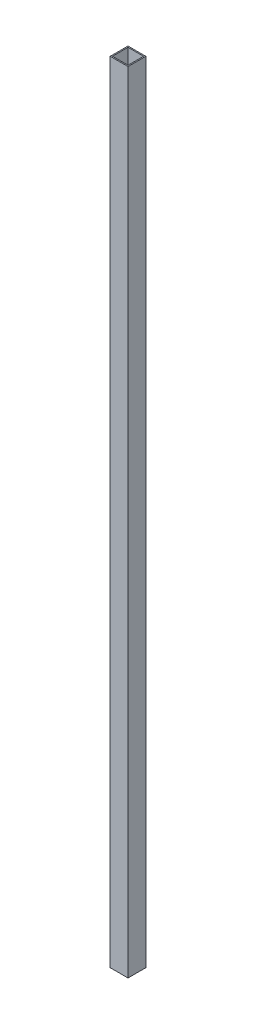
ISO-10303-21;
HEADER;
FILE_DESCRIPTION(('STEP AP214'),'2;1');
FILE_NAME('part.step','',(''),(''),'','','');
FILE_SCHEMA(('AUTOMOTIVE_DESIGN { 1 0 10303 214 1 1 1 1 }'));
ENDSEC;
DATA;
#1=APPLICATION_CONTEXT('core data for automotive mechanical design processes');
#2=APPLICATION_PROTOCOL_DEFINITION('international standard','automotive_design',2000,#1);
#3=PRODUCT_CONTEXT('',#1,'mechanical');
#4=PRODUCT('Part','Part','',(#3));
#5=PRODUCT_RELATED_PRODUCT_CATEGORY('part','',(#4));
#6=PRODUCT_DEFINITION_FORMATION('','',#4);
#7=PRODUCT_DEFINITION_CONTEXT('part definition',#1,'design');
#8=PRODUCT_DEFINITION('design','',#6,#7);
#9=PRODUCT_DEFINITION_SHAPE('','',#8);
#10=(LENGTH_UNIT() NAMED_UNIT(*) SI_UNIT(.MILLI.,.METRE.));
#11=(NAMED_UNIT(*) PLANE_ANGLE_UNIT() SI_UNIT($,.RADIAN.));
#12=(NAMED_UNIT(*) SI_UNIT($,.STERADIAN.) SOLID_ANGLE_UNIT());
#13=UNCERTAINTY_MEASURE_WITH_UNIT(LENGTH_MEASURE(1.E-05),#10,'distance_accuracy_value','');
#14=(GEOMETRIC_REPRESENTATION_CONTEXT(3) GLOBAL_UNCERTAINTY_ASSIGNED_CONTEXT((#13)) GLOBAL_UNIT_ASSIGNED_CONTEXT((#10,
#11,#12)) REPRESENTATION_CONTEXT('',''));
#15=CARTESIAN_POINT('',(0.,0.,0.));
#16=DIRECTION('',(0.,0.,1.));
#17=DIRECTION('',(1.,0.,0.));
#18=AXIS2_PLACEMENT_3D('',#15,#16,#17);
#19=CARTESIAN_POINT('',(0.,2254.25,0.));
#20=DIRECTION('',(0.,1.,0.));
#21=DIRECTION('',(0.,0.,1.));
#22=AXIS2_PLACEMENT_3D('',#19,#20,#21);
#23=PLANE('',#22);
#24=DIRECTION('',(0.,0.,-1.));
#25=VECTOR('',#24,1.);
#26=CARTESIAN_POINT('',(25.4,2254.25,-25.4));
#27=LINE('',#26,#25);
#28=CARTESIAN_POINT('',(25.4,2254.25,25.4));
#29=VERTEX_POINT('',#28);
#30=CARTESIAN_POINT('',(25.4,2254.25,-25.4));
#31=VERTEX_POINT('',#30);
#32=EDGE_CURVE('E153',#29,#31,#27,.T.);
#33=ORIENTED_EDGE('',*,*,#32,.T.);
#34=DIRECTION('',(-1.,0.,0.));
#35=VECTOR('',#34,1.);
#36=CARTESIAN_POINT('',(-25.4,2254.25,-25.4));
#37=LINE('',#36,#35);
#38=CARTESIAN_POINT('',(-25.4,2254.25,-25.4));
#39=VERTEX_POINT('',#38);
#40=EDGE_CURVE('E157',#31,#39,#37,.T.);
#41=ORIENTED_EDGE('',*,*,#40,.T.);
#42=DIRECTION('',(0.,0.,1.));
#43=VECTOR('',#42,1.);
#44=CARTESIAN_POINT('',(-25.4,2254.25,-25.4));
#45=LINE('',#44,#43);
#46=CARTESIAN_POINT('',(-25.4,2254.25,25.4));
#47=VERTEX_POINT('',#46);
#48=EDGE_CURVE('E161',#39,#47,#45,.T.);
#49=ORIENTED_EDGE('',*,*,#48,.T.);
#50=DIRECTION('',(1.,0.,0.));
#51=VECTOR('',#50,1.);
#52=CARTESIAN_POINT('',(-25.4,2254.25,25.4));
#53=LINE('',#52,#51);
#54=EDGE_CURVE('E164',#47,#29,#53,.T.);
#55=ORIENTED_EDGE('',*,*,#54,.T.);
#56=EDGE_LOOP('',(#33,#41,#49,#55));
#57=FACE_BOUND('',#56,.T.);
#58=DIRECTION('',(-1.,0.,0.));
#59=VECTOR('',#58,1.);
#60=CARTESIAN_POINT('',(-22.225,2254.25,-22.225));
#61=LINE('',#60,#59);
#62=CARTESIAN_POINT('',(22.225,2254.25,-22.225));
#63=VERTEX_POINT('',#62);
#64=CARTESIAN_POINT('',(-22.225,2254.25,-22.225));
#65=VERTEX_POINT('',#64);
#66=EDGE_CURVE('E114',#63,#65,#61,.T.);
#67=ORIENTED_EDGE('',*,*,#66,.F.);
#68=DIRECTION('',(0.,0.,-1.));
#69=VECTOR('',#68,1.);
#70=CARTESIAN_POINT('',(22.225,2254.25,-22.225));
#71=LINE('',#70,#69);
#72=CARTESIAN_POINT('',(22.225,2254.25,22.225));
#73=VERTEX_POINT('',#72);
#74=EDGE_CURVE('E105',#73,#63,#71,.T.);
#75=ORIENTED_EDGE('',*,*,#74,.F.);
#76=DIRECTION('',(1.,0.,0.));
#77=VECTOR('',#76,1.);
#78=CARTESIAN_POINT('',(-22.225,2254.25,22.225));
#79=LINE('',#78,#77);
#80=CARTESIAN_POINT('',(-22.225,2254.25,22.225));
#81=VERTEX_POINT('',#80);
#82=EDGE_CURVE('E131',#81,#73,#79,.T.);
#83=ORIENTED_EDGE('',*,*,#82,.F.);
#84=DIRECTION('',(0.,0.,1.));
#85=VECTOR('',#84,1.);
#86=CARTESIAN_POINT('',(-22.225,2254.25,-22.225));
#87=LINE('',#86,#85);
#88=EDGE_CURVE('E127',#65,#81,#87,.T.);
#89=ORIENTED_EDGE('',*,*,#88,.F.);
#90=EDGE_LOOP('',(#67,#75,#83,#89));
#91=FACE_BOUND('',#90,.T.);
#92=ADVANCED_FACE('F39',(#57,#91),#23,.T.);
#93=CARTESIAN_POINT('',(0.,0.,0.));
#94=DIRECTION('',(0.,1.,0.));
#95=DIRECTION('',(0.,0.,1.));
#96=AXIS2_PLACEMENT_3D('',#93,#94,#95);
#97=PLANE('',#96);
#98=DIRECTION('',(0.,0.,-1.));
#99=VECTOR('',#98,1.);
#100=CARTESIAN_POINT('',(25.4,0.,-25.4));
#101=LINE('',#100,#99);
#102=CARTESIAN_POINT('',(25.4,0.,25.4));
#103=VERTEX_POINT('',#102);
#104=CARTESIAN_POINT('',(25.4,0.,-25.4));
#105=VERTEX_POINT('',#104);
#106=EDGE_CURVE('E123',#103,#105,#101,.T.);
#107=ORIENTED_EDGE('',*,*,#106,.F.);
#108=DIRECTION('',(1.,0.,0.));
#109=VECTOR('',#108,1.);
#110=CARTESIAN_POINT('',(-25.4,0.,25.4));
#111=LINE('',#110,#109);
#112=CARTESIAN_POINT('',(-25.4,0.,25.4));
#113=VERTEX_POINT('',#112);
#114=EDGE_CURVE('E158',#113,#103,#111,.T.);
#115=ORIENTED_EDGE('',*,*,#114,.F.);
#116=DIRECTION('',(0.,0.,1.));
#117=VECTOR('',#116,1.);
#118=CARTESIAN_POINT('',(-25.4,0.,-25.4));
#119=LINE('',#118,#117);
#120=CARTESIAN_POINT('',(-25.4,0.,-25.4));
#121=VERTEX_POINT('',#120);
#122=EDGE_CURVE('E174',#121,#113,#119,.T.);
#123=ORIENTED_EDGE('',*,*,#122,.F.);
#124=DIRECTION('',(-1.,0.,0.));
#125=VECTOR('',#124,1.);
#126=CARTESIAN_POINT('',(-25.4,0.,-25.4));
#127=LINE('',#126,#125);
#128=EDGE_CURVE('E171',#105,#121,#127,.T.);
#129=ORIENTED_EDGE('',*,*,#128,.F.);
#130=EDGE_LOOP('',(#107,#115,#123,#129));
#131=FACE_BOUND('',#130,.T.);
#132=DIRECTION('',(0.,0.,-1.));
#133=VECTOR('',#132,1.);
#134=CARTESIAN_POINT('',(22.225,0.,-22.225));
#135=LINE('',#134,#133);
#136=CARTESIAN_POINT('',(22.225,0.,22.225));
#137=VERTEX_POINT('',#136);
#138=CARTESIAN_POINT('',(22.225,0.,-22.225));
#139=VERTEX_POINT('',#138);
#140=EDGE_CURVE('E63',#137,#139,#135,.T.);
#141=ORIENTED_EDGE('',*,*,#140,.T.);
#142=DIRECTION('',(-1.,0.,0.));
#143=VECTOR('',#142,1.);
#144=CARTESIAN_POINT('',(-22.225,0.,-22.225));
#145=LINE('',#144,#143);
#146=CARTESIAN_POINT('',(-22.225,0.,-22.225));
#147=VERTEX_POINT('',#146);
#148=EDGE_CURVE('E121',#139,#147,#145,.T.);
#149=ORIENTED_EDGE('',*,*,#148,.T.);
#150=DIRECTION('',(0.,0.,1.));
#151=VECTOR('',#150,1.);
#152=CARTESIAN_POINT('',(-22.225,0.,-22.225));
#153=LINE('',#152,#151);
#154=CARTESIAN_POINT('',(-22.225,0.,22.225));
#155=VERTEX_POINT('',#154);
#156=EDGE_CURVE('E140',#147,#155,#153,.T.);
#157=ORIENTED_EDGE('',*,*,#156,.T.);
#158=DIRECTION('',(1.,0.,0.));
#159=VECTOR('',#158,1.);
#160=CARTESIAN_POINT('',(-22.225,0.,22.225));
#161=LINE('',#160,#159);
#162=EDGE_CURVE('E115',#155,#137,#161,.T.);
#163=ORIENTED_EDGE('',*,*,#162,.T.);
#164=EDGE_LOOP('',(#141,#149,#157,#163));
#165=FACE_BOUND('',#164,.T.);
#166=ADVANCED_FACE('F197',(#131,#165),#97,.F.);
#167=CARTESIAN_POINT('',(25.4,2254.25,-25.4));
#168=DIRECTION('',(-1.,0.,0.));
#169=DIRECTION('',(0.,0.,1.));
#170=AXIS2_PLACEMENT_3D('',#167,#168,#169);
#171=PLANE('',#170);
#172=ORIENTED_EDGE('',*,*,#106,.T.);
#173=DIRECTION('',(0.,-1.,0.));
#174=VECTOR('',#173,1.);
#175=CARTESIAN_POINT('',(25.4,2254.25,-25.4));
#176=LINE('',#175,#174);
#177=EDGE_CURVE('E11',#31,#105,#176,.T.);
#178=ORIENTED_EDGE('',*,*,#177,.F.);
#179=ORIENTED_EDGE('',*,*,#32,.F.);
#180=DIRECTION('',(0.,-1.,0.));
#181=VECTOR('',#180,1.);
#182=CARTESIAN_POINT('',(25.4,2254.25,25.4));
#183=LINE('',#182,#181);
#184=EDGE_CURVE('E167',#29,#103,#183,.T.);
#185=ORIENTED_EDGE('',*,*,#184,.T.);
#186=EDGE_LOOP('',(#172,#178,#179,#185));
#187=FACE_BOUND('',#186,.T.);
#188=ADVANCED_FACE('F41',(#187),#171,.F.);
#189=CARTESIAN_POINT('',(-25.4,2254.25,-25.4));
#190=DIRECTION('',(0.,0.,1.));
#191=DIRECTION('',(1.,0.,0.));
#192=AXIS2_PLACEMENT_3D('',#189,#190,#191);
#193=PLANE('',#192);
#194=ORIENTED_EDGE('',*,*,#128,.T.);
#195=DIRECTION('',(0.,-1.,0.));
#196=VECTOR('',#195,1.);
#197=CARTESIAN_POINT('',(-25.4,2254.25,-25.4));
#198=LINE('',#197,#196);
#199=EDGE_CURVE('E48',#39,#121,#198,.T.);
#200=ORIENTED_EDGE('',*,*,#199,.F.);
#201=ORIENTED_EDGE('',*,*,#40,.F.);
#202=ORIENTED_EDGE('',*,*,#177,.T.);
#203=EDGE_LOOP('',(#194,#200,#201,#202));
#204=FACE_BOUND('',#203,.T.);
#205=ADVANCED_FACE('F207',(#204),#193,.F.);
#206=CARTESIAN_POINT('',(-25.4,2254.25,-25.4));
#207=DIRECTION('',(1.,0.,0.));
#208=DIRECTION('',(0.,0.,-1.));
#209=AXIS2_PLACEMENT_3D('',#206,#207,#208);
#210=PLANE('',#209);
#211=ORIENTED_EDGE('',*,*,#122,.T.);
#212=DIRECTION('',(0.,-1.,0.));
#213=VECTOR('',#212,1.);
#214=CARTESIAN_POINT('',(-25.4,2254.25,25.4));
#215=LINE('',#214,#213);
#216=EDGE_CURVE('E182',#47,#113,#215,.T.);
#217=ORIENTED_EDGE('',*,*,#216,.F.);
#218=ORIENTED_EDGE('',*,*,#48,.F.);
#219=ORIENTED_EDGE('',*,*,#199,.T.);
#220=EDGE_LOOP('',(#211,#217,#218,#219));
#221=FACE_BOUND('',#220,.T.);
#222=ADVANCED_FACE('F191',(#221),#210,.F.);
#223=CARTESIAN_POINT('',(-25.4,2254.25,25.4));
#224=DIRECTION('',(0.,0.,-1.));
#225=DIRECTION('',(-1.,0.,0.));
#226=AXIS2_PLACEMENT_3D('',#223,#224,#225);
#227=PLANE('',#226);
#228=ORIENTED_EDGE('',*,*,#114,.T.);
#229=ORIENTED_EDGE('',*,*,#184,.F.);
#230=ORIENTED_EDGE('',*,*,#54,.F.);
#231=ORIENTED_EDGE('',*,*,#216,.T.);
#232=EDGE_LOOP('',(#228,#229,#230,#231));
#233=FACE_BOUND('',#232,.T.);
#234=ADVANCED_FACE('F201',(#233),#227,.F.);
#235=CARTESIAN_POINT('',(22.225,2254.25,-22.225));
#236=DIRECTION('',(-1.,0.,0.));
#237=DIRECTION('',(0.,0.,1.));
#238=AXIS2_PLACEMENT_3D('',#235,#236,#237);
#239=PLANE('',#238);
#240=ORIENTED_EDGE('',*,*,#140,.F.);
#241=DIRECTION('',(0.,-1.,0.));
#242=VECTOR('',#241,1.);
#243=CARTESIAN_POINT('',(22.225,2254.25,22.225));
#244=LINE('',#243,#242);
#245=EDGE_CURVE('E109',#73,#137,#244,.T.);
#246=ORIENTED_EDGE('',*,*,#245,.F.);
#247=ORIENTED_EDGE('',*,*,#74,.T.);
#248=DIRECTION('',(0.,-1.,0.));
#249=VECTOR('',#248,1.);
#250=CARTESIAN_POINT('',(22.225,2254.25,-22.225));
#251=LINE('',#250,#249);
#252=EDGE_CURVE('E108',#63,#139,#251,.T.);
#253=ORIENTED_EDGE('',*,*,#252,.T.);
#254=EDGE_LOOP('',(#240,#246,#247,#253));
#255=FACE_BOUND('',#254,.T.);
#256=ADVANCED_FACE('F107',(#255),#239,.T.);
#257=CARTESIAN_POINT('',(-22.225,2254.25,-22.225));
#258=DIRECTION('',(0.,0.,1.));
#259=DIRECTION('',(1.,0.,0.));
#260=AXIS2_PLACEMENT_3D('',#257,#258,#259);
#261=PLANE('',#260);
#262=ORIENTED_EDGE('',*,*,#148,.F.);
#263=ORIENTED_EDGE('',*,*,#252,.F.);
#264=ORIENTED_EDGE('',*,*,#66,.T.);
#265=DIRECTION('',(0.,-1.,0.));
#266=VECTOR('',#265,1.);
#267=CARTESIAN_POINT('',(-22.225,2254.25,-22.225));
#268=LINE('',#267,#266);
#269=EDGE_CURVE('E124',#65,#147,#268,.T.);
#270=ORIENTED_EDGE('',*,*,#269,.T.);
#271=EDGE_LOOP('',(#262,#263,#264,#270));
#272=FACE_BOUND('',#271,.T.);
#273=ADVANCED_FACE('F118',(#272),#261,.T.);
#274=CARTESIAN_POINT('',(-22.225,2254.25,-22.225));
#275=DIRECTION('',(1.,0.,0.));
#276=DIRECTION('',(0.,0.,-1.));
#277=AXIS2_PLACEMENT_3D('',#274,#275,#276);
#278=PLANE('',#277);
#279=ORIENTED_EDGE('',*,*,#156,.F.);
#280=ORIENTED_EDGE('',*,*,#269,.F.);
#281=ORIENTED_EDGE('',*,*,#88,.T.);
#282=DIRECTION('',(0.,-1.,0.));
#283=VECTOR('',#282,1.);
#284=CARTESIAN_POINT('',(-22.225,2254.25,22.225));
#285=LINE('',#284,#283);
#286=EDGE_CURVE('E55',#81,#155,#285,.T.);
#287=ORIENTED_EDGE('',*,*,#286,.T.);
#288=EDGE_LOOP('',(#279,#280,#281,#287));
#289=FACE_BOUND('',#288,.T.);
#290=ADVANCED_FACE('F230',(#289),#278,.T.);
#291=CARTESIAN_POINT('',(-22.225,2254.25,22.225));
#292=DIRECTION('',(0.,0.,-1.));
#293=DIRECTION('',(-1.,0.,0.));
#294=AXIS2_PLACEMENT_3D('',#291,#292,#293);
#295=PLANE('',#294);
#296=ORIENTED_EDGE('',*,*,#162,.F.);
#297=ORIENTED_EDGE('',*,*,#286,.F.);
#298=ORIENTED_EDGE('',*,*,#82,.T.);
#299=ORIENTED_EDGE('',*,*,#245,.T.);
#300=EDGE_LOOP('',(#296,#297,#298,#299));
#301=FACE_BOUND('',#300,.T.);
#302=ADVANCED_FACE('F234',(#301),#295,.T.);
#303=CLOSED_SHELL('',(#92,#166,#188,#205,#222,#234,#256,#273,#290,#302));
#304=MANIFOLD_SOLID_BREP('B2',#303);
#305=ADVANCED_BREP_SHAPE_REPRESENTATION('',(#18,#304),#14);
#306=SHAPE_DEFINITION_REPRESENTATION(#9,#305);
ENDSEC;
END-ISO-10303-21;
